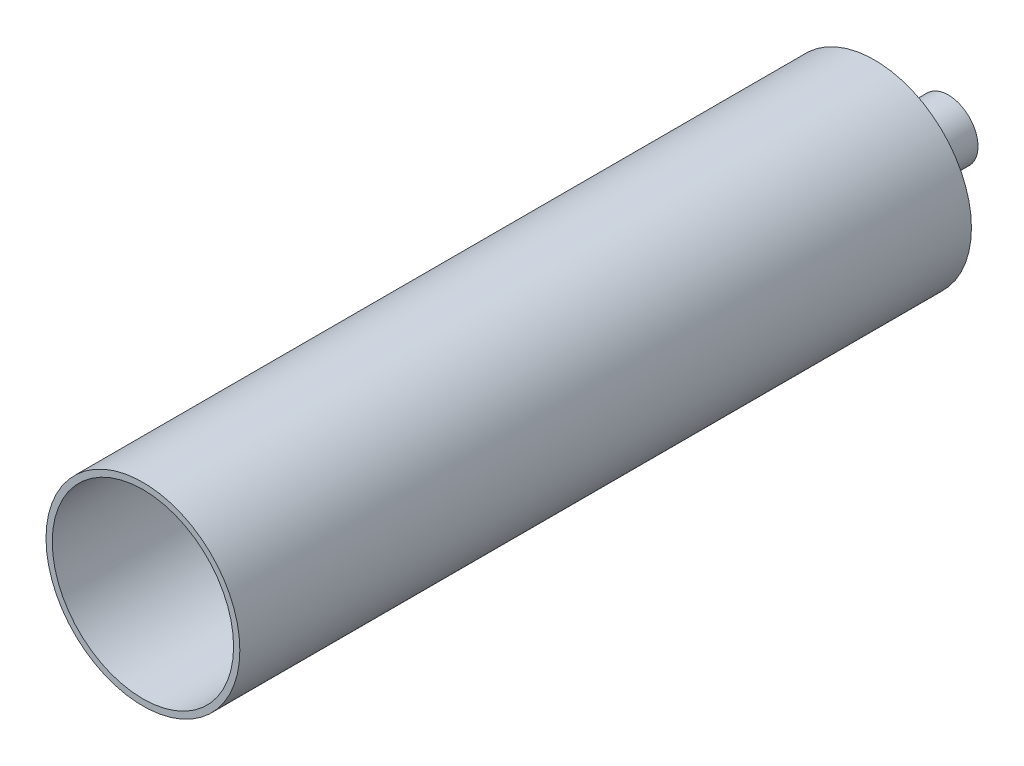
ISO-10303-21;
HEADER;
FILE_DESCRIPTION(('STEP AP214'),'2;1');
FILE_NAME('part.step','',(''),(''),'','','');
FILE_SCHEMA(('AUTOMOTIVE_DESIGN { 1 0 10303 214 1 1 1 1 }'));
ENDSEC;
DATA;
#1=APPLICATION_CONTEXT('core data for automotive mechanical design processes');
#2=APPLICATION_PROTOCOL_DEFINITION('international standard','automotive_design',2000,#1);
#3=PRODUCT_CONTEXT('',#1,'mechanical');
#4=PRODUCT('Part','Part','',(#3));
#5=PRODUCT_RELATED_PRODUCT_CATEGORY('part','',(#4));
#6=PRODUCT_DEFINITION_FORMATION('','',#4);
#7=PRODUCT_DEFINITION_CONTEXT('part definition',#1,'design');
#8=PRODUCT_DEFINITION('design','',#6,#7);
#9=PRODUCT_DEFINITION_SHAPE('','',#8);
#10=(LENGTH_UNIT() NAMED_UNIT(*) SI_UNIT(.MILLI.,.METRE.));
#11=(NAMED_UNIT(*) PLANE_ANGLE_UNIT() SI_UNIT($,.RADIAN.));
#12=(NAMED_UNIT(*) SI_UNIT($,.STERADIAN.) SOLID_ANGLE_UNIT());
#13=UNCERTAINTY_MEASURE_WITH_UNIT(LENGTH_MEASURE(1.E-05),#10,'distance_accuracy_value','');
#14=(GEOMETRIC_REPRESENTATION_CONTEXT(3) GLOBAL_UNCERTAINTY_ASSIGNED_CONTEXT((#13)) GLOBAL_UNIT_ASSIGNED_CONTEXT((#10,
#11,#12)) REPRESENTATION_CONTEXT('',''));
#15=CARTESIAN_POINT('',(0.,0.,0.));
#16=DIRECTION('',(0.,0.,1.));
#17=DIRECTION('',(1.,0.,0.));
#18=AXIS2_PLACEMENT_3D('',#15,#16,#17);
#19=CARTESIAN_POINT('',(0.,0.,117.));
#20=DIRECTION('',(0.,0.,1.));
#21=DIRECTION('',(1.,0.,0.));
#22=AXIS2_PLACEMENT_3D('',#19,#20,#21);
#23=PLANE('',#22);
#24=CARTESIAN_POINT('',(0.,0.,117.));
#25=DIRECTION('',(0.,0.,1.));
#26=DIRECTION('',(1.,0.,0.));
#27=AXIS2_PLACEMENT_3D('',#24,#25,#26);
#28=CIRCLE('',#27,15.5);
#29=CARTESIAN_POINT('',(15.5,0.,117.));
#30=VERTEX_POINT('',#29);
#31=EDGE_CURVE('E10',#30,#30,#28,.T.);
#32=ORIENTED_EDGE('',*,*,#31,.T.);
#33=EDGE_LOOP('',(#32));
#34=FACE_BOUND('',#33,.T.);
#35=CARTESIAN_POINT('',(0.,0.,117.));
#36=DIRECTION('',(0.,0.,1.));
#37=DIRECTION('',(1.,0.,0.));
#38=AXIS2_PLACEMENT_3D('',#35,#36,#37);
#39=CIRCLE('',#38,14.5);
#40=CARTESIAN_POINT('',(14.5,0.,117.));
#41=VERTEX_POINT('',#40);
#42=EDGE_CURVE('E45',#41,#41,#39,.T.);
#43=ORIENTED_EDGE('',*,*,#42,.F.);
#44=EDGE_LOOP('',(#43));
#45=FACE_BOUND('',#44,.T.);
#46=ADVANCED_FACE('F38',(#34,#45),#23,.T.);
#47=CARTESIAN_POINT('',(0.,0.,117.));
#48=DIRECTION('',(0.,0.,-1.));
#49=DIRECTION('',(-1.,0.,0.));
#50=AXIS2_PLACEMENT_3D('',#47,#48,#49);
#51=CYLINDRICAL_SURFACE('',#50,15.5);
#52=ORIENTED_EDGE('',*,*,#31,.F.);
#53=EDGE_LOOP('',(#52));
#54=FACE_BOUND('',#53,.T.);
#55=CARTESIAN_POINT('',(0.,0.,0.));
#56=DIRECTION('',(0.,0.,1.));
#57=DIRECTION('',(1.,0.,0.));
#58=AXIS2_PLACEMENT_3D('',#55,#56,#57);
#59=CIRCLE('',#58,15.5);
#60=CARTESIAN_POINT('',(15.5,0.,0.));
#61=VERTEX_POINT('',#60);
#62=EDGE_CURVE('E61',#61,#61,#59,.T.);
#63=ORIENTED_EDGE('',*,*,#62,.T.);
#64=EDGE_LOOP('',(#63));
#65=FACE_BOUND('',#64,.T.);
#66=ADVANCED_FACE('F40',(#54,#65),#51,.T.);
#67=CARTESIAN_POINT('',(0.,0.,117.));
#68=DIRECTION('',(0.,0.,-1.));
#69=DIRECTION('',(-1.,0.,0.));
#70=AXIS2_PLACEMENT_3D('',#67,#68,#69);
#71=CYLINDRICAL_SURFACE('',#70,14.5);
#72=ORIENTED_EDGE('',*,*,#42,.T.);
#73=EDGE_LOOP('',(#72));
#74=FACE_BOUND('',#73,.T.);
#75=CARTESIAN_POINT('',(0.,0.,0.));
#76=DIRECTION('',(0.,0.,1.));
#77=DIRECTION('',(1.,0.,0.));
#78=AXIS2_PLACEMENT_3D('',#75,#76,#77);
#79=CIRCLE('',#78,14.5);
#80=CARTESIAN_POINT('',(14.5,0.,0.));
#81=VERTEX_POINT('',#80);
#82=EDGE_CURVE('E49',#81,#81,#79,.T.);
#83=ORIENTED_EDGE('',*,*,#82,.F.);
#84=EDGE_LOOP('',(#83));
#85=FACE_BOUND('',#84,.T.);
#86=ADVANCED_FACE('F94',(#74,#85),#71,.F.);
#87=CARTESIAN_POINT('',(0.,0.,-3.3));
#88=DIRECTION('',(0.,0.,1.));
#89=DIRECTION('',(1.,0.,0.));
#90=AXIS2_PLACEMENT_3D('',#87,#88,#89);
#91=PLANE('',#90);
#92=CARTESIAN_POINT('',(0.,0.,-3.3));
#93=DIRECTION('',(0.,0.,1.));
#94=DIRECTION('',(1.,0.,0.));
#95=AXIS2_PLACEMENT_3D('',#92,#93,#94);
#96=CIRCLE('',#95,4.75);
#97=CARTESIAN_POINT('',(4.75,0.,-3.3));
#98=VERTEX_POINT('',#97);
#99=EDGE_CURVE('E54',#98,#98,#96,.T.);
#100=ORIENTED_EDGE('',*,*,#99,.T.);
#101=EDGE_LOOP('',(#100));
#102=FACE_BOUND('',#101,.T.);
#103=ADVANCED_FACE('F98',(#102),#91,.T.);
#104=CARTESIAN_POINT('',(0.,0.,-3.3));
#105=DIRECTION('',(0.,0.,1.));
#106=DIRECTION('',(1.,0.,0.));
#107=AXIS2_PLACEMENT_3D('',#104,#105,#106);
#108=CONICAL_SURFACE('',#107,4.75,1.19028994968253);
#109=CARTESIAN_POINT('',(0.,0.,0.));
#110=DIRECTION('',(0.,0.,1.));
#111=DIRECTION('',(1.,0.,0.));
#112=AXIS2_PLACEMENT_3D('',#109,#110,#111);
#113=CIRCLE('',#112,13.);
#114=CARTESIAN_POINT('',(13.,0.,0.));
#115=VERTEX_POINT('',#114);
#116=EDGE_CURVE('E58',#115,#115,#113,.T.);
#117=ORIENTED_EDGE('',*,*,#116,.T.);
#118=EDGE_LOOP('',(#117));
#119=FACE_BOUND('',#118,.T.);
#120=ORIENTED_EDGE('',*,*,#99,.F.);
#121=EDGE_LOOP('',(#120));
#122=FACE_BOUND('',#121,.T.);
#123=ADVANCED_FACE('F85',(#119,#122),#108,.F.);
#124=CARTESIAN_POINT('',(0.,0.,0.));
#125=DIRECTION('',(0.,0.,1.));
#126=DIRECTION('',(1.,0.,0.));
#127=AXIS2_PLACEMENT_3D('',#124,#125,#126);
#128=PLANE('',#127);
#129=ORIENTED_EDGE('',*,*,#116,.F.);
#130=EDGE_LOOP('',(#129));
#131=FACE_BOUND('',#130,.T.);
#132=ORIENTED_EDGE('',*,*,#82,.T.);
#133=EDGE_LOOP('',(#132));
#134=FACE_BOUND('',#133,.T.);
#135=ADVANCED_FACE('F77',(#131,#134),#128,.T.);
#136=CARTESIAN_POINT('',(0.,0.,-11.8));
#137=DIRECTION('',(0.,0.,-1.));
#138=DIRECTION('',(-1.,0.,0.));
#139=AXIS2_PLACEMENT_3D('',#136,#137,#138);
#140=PLANE('',#139);
#141=CARTESIAN_POINT('',(0.,0.,-11.8));
#142=DIRECTION('',(0.,0.,1.));
#143=DIRECTION('',(1.,0.,0.));
#144=AXIS2_PLACEMENT_3D('',#141,#142,#143);
#145=CIRCLE('',#144,4.75);
#146=CARTESIAN_POINT('',(4.75,0.,-11.8));
#147=VERTEX_POINT('',#146);
#148=EDGE_CURVE('E67',#147,#147,#145,.T.);
#149=ORIENTED_EDGE('',*,*,#148,.F.);
#150=EDGE_LOOP('',(#149));
#151=FACE_BOUND('',#150,.T.);
#152=ADVANCED_FACE('F74',(#151),#140,.T.);
#153=CARTESIAN_POINT('',(0.,0.,-4.3));
#154=DIRECTION('',(0.,0.,1.));
#155=DIRECTION('',(1.,0.,0.));
#156=AXIS2_PLACEMENT_3D('',#153,#154,#155);
#157=CONICAL_SURFACE('',#156,4.75,1.19028994968253);
#158=CARTESIAN_POINT('',(0.,0.,-4.3));
#159=DIRECTION('',(0.,0.,1.));
#160=DIRECTION('',(1.,0.,0.));
#161=AXIS2_PLACEMENT_3D('',#158,#159,#160);
#162=CIRCLE('',#161,4.75);
#163=CARTESIAN_POINT('',(4.75,0.,-4.3));
#164=VERTEX_POINT('',#163);
#165=EDGE_CURVE('E64',#164,#164,#162,.T.);
#166=CARTESIAN_POINT('',(15.5,0.,0.));
#167=CARTESIAN_POINT('',(15.3880208333333,0.,-0.0447916666666661));
#168=CARTESIAN_POINT('',(15.2760416666667,0.,-0.0895833333333329));
#169=CARTESIAN_POINT('',(15.0520833333333,0.,-0.179166666666667));
#170=CARTESIAN_POINT('',(14.9401041666667,0.,-0.223958333333333));
#171=CARTESIAN_POINT('',(14.7161458333333,0.,-0.313541666666667));
#172=CARTESIAN_POINT('',(14.6041666666667,0.,-0.358333333333333));
#173=CARTESIAN_POINT('',(14.3802083333333,0.,-0.447916666666666));
#174=CARTESIAN_POINT('',(14.2682291666667,0.,-0.492708333333333));
#175=CARTESIAN_POINT('',(14.0442708333333,0.,-0.582291666666666));
#176=CARTESIAN_POINT('',(13.9322916666667,0.,-0.627083333333333));
#177=CARTESIAN_POINT('',(13.7083333333333,0.,-0.716666666666667));
#178=CARTESIAN_POINT('',(13.5963541666667,0.,-0.761458333333333));
#179=CARTESIAN_POINT('',(13.3723958333333,0.,-0.851041666666666));
#180=CARTESIAN_POINT('',(13.2604166666667,0.,-0.895833333333333));
#181=CARTESIAN_POINT('',(13.0364583333333,0.,-0.985416666666666));
#182=CARTESIAN_POINT('',(12.9244791666667,0.,-1.03020833333333));
#183=CARTESIAN_POINT('',(12.7005208333333,0.,-1.11979166666667));
#184=CARTESIAN_POINT('',(12.5885416666667,0.,-1.16458333333333));
#185=CARTESIAN_POINT('',(12.3645833333333,0.,-1.25416666666667));
#186=CARTESIAN_POINT('',(12.2526041666667,0.,-1.29895833333333));
#187=CARTESIAN_POINT('',(12.0286458333333,0.,-1.38854166666667));
#188=CARTESIAN_POINT('',(11.9166666666667,0.,-1.43333333333333));
#189=CARTESIAN_POINT('',(11.6927083333333,0.,-1.52291666666667));
#190=CARTESIAN_POINT('',(11.5807291666667,0.,-1.56770833333333));
#191=CARTESIAN_POINT('',(11.3567708333333,0.,-1.65729166666667));
#192=CARTESIAN_POINT('',(11.2447916666667,0.,-1.70208333333333));
#193=CARTESIAN_POINT('',(11.0208333333333,0.,-1.79166666666667));
#194=CARTESIAN_POINT('',(10.9088541666667,0.,-1.83645833333333));
#195=CARTESIAN_POINT('',(10.6848958333333,0.,-1.92604166666667));
#196=CARTESIAN_POINT('',(10.5729166666667,0.,-1.97083333333333));
#197=CARTESIAN_POINT('',(10.3489583333333,0.,-2.06041666666667));
#198=CARTESIAN_POINT('',(10.2369791666667,0.,-2.10520833333333));
#199=CARTESIAN_POINT('',(10.0130208333333,0.,-2.19479166666667));
#200=CARTESIAN_POINT('',(9.90104166666667,0.,-2.23958333333333));
#201=CARTESIAN_POINT('',(9.67708333333333,0.,-2.32916666666667));
#202=CARTESIAN_POINT('',(9.56510416666667,0.,-2.37395833333333));
#203=CARTESIAN_POINT('',(9.34114583333333,0.,-2.46354166666667));
#204=CARTESIAN_POINT('',(9.22916666666666,0.,-2.50833333333333));
#205=CARTESIAN_POINT('',(9.00520833333333,0.,-2.59791666666667));
#206=CARTESIAN_POINT('',(8.89322916666667,0.,-2.64270833333333));
#207=CARTESIAN_POINT('',(8.66927083333333,0.,-2.73229166666667));
#208=CARTESIAN_POINT('',(8.55729166666667,0.,-2.77708333333333));
#209=CARTESIAN_POINT('',(8.33333333333333,0.,-2.86666666666667));
#210=CARTESIAN_POINT('',(8.22135416666667,0.,-2.91145833333333));
#211=CARTESIAN_POINT('',(7.99739583333333,0.,-3.00104166666667));
#212=CARTESIAN_POINT('',(7.88541666666667,0.,-3.04583333333333));
#213=CARTESIAN_POINT('',(7.66145833333333,0.,-3.13541666666667));
#214=CARTESIAN_POINT('',(7.54947916666667,0.,-3.18020833333333));
#215=CARTESIAN_POINT('',(7.32552083333333,0.,-3.26979166666667));
#216=CARTESIAN_POINT('',(7.21354166666667,0.,-3.31458333333333));
#217=CARTESIAN_POINT('',(6.98958333333333,0.,-3.40416666666667));
#218=CARTESIAN_POINT('',(6.87760416666667,0.,-3.44895833333333));
#219=CARTESIAN_POINT('',(6.65364583333333,0.,-3.53854166666666));
#220=CARTESIAN_POINT('',(6.54166666666667,0.,-3.58333333333333));
#221=CARTESIAN_POINT('',(6.31770833333333,0.,-3.67291666666666));
#222=CARTESIAN_POINT('',(6.20572916666667,0.,-3.71770833333333));
#223=CARTESIAN_POINT('',(5.98177083333333,0.,-3.80729166666667));
#224=CARTESIAN_POINT('',(5.86979166666667,0.,-3.85208333333333));
#225=CARTESIAN_POINT('',(5.64583333333333,0.,-3.94166666666667));
#226=CARTESIAN_POINT('',(5.53385416666667,0.,-3.98645833333333));
#227=CARTESIAN_POINT('',(5.30989583333333,0.,-4.07604166666667));
#228=CARTESIAN_POINT('',(5.19791666666667,0.,-4.12083333333333));
#229=CARTESIAN_POINT('',(4.97395833333333,0.,-4.21041666666667));
#230=CARTESIAN_POINT('',(4.86197916666667,0.,-4.25520833333333));
#231=CARTESIAN_POINT('',(4.75,0.,-4.3));
#232=B_SPLINE_CURVE_WITH_KNOTS('',3,(#166,#167,#168,#169,#170,#171,#172,#173,#174,#175,#176,
#177,#178,#179,#180,#181,#182,#183,#184,#185,#186,#187,#188,#189,#190,#191,#192,#193,#194,#195,
#196,#197,#198,#199,#200,#201,#202,#203,#204,#205,#206,#207,#208,#209,#210,#211,#212,#213,#214,
#215,#216,#217,#218,#219,#220,#221,#222,#223,#224,#225,#226,#227,#228,#229,#230,#231),
.UNSPECIFIED.,.F.,.F.,(4,2,2,2,2,2,2,2,2,2,2,2,2,2,2,2,2,2,2,2,2,2,2,2,2,2,2,2,2,2,2,2,4),(0.,
0.361815760479351,0.723631520958698,1.08544728143805,1.4472630419174,1.80907880239675,
2.1708945628761,2.53271032335545,2.89452608383479,3.25634184431415,3.6181576047935,
3.97997336527284,4.34178912575219,4.70360488623154,5.06542064671089,5.42723640719024,
5.78905216766959,6.15086792814894,6.51268368862829,6.87449944910764,7.23631520958699,
7.59813097006634,7.95994673054569,8.32176249102504,8.68357825150439,9.04539401198374,
9.40720977246309,9.76902553294244,10.1308412934218,10.4926570539011,10.8544728143805,
11.2162885748598,11.5781043353392),.UNSPECIFIED.);
#233=EDGE_CURVE('BSEAM76',#61,#164,#232,.T.);
#234=ORIENTED_EDGE('',*,*,#62,.F.);
#235=ORIENTED_EDGE('',*,*,#165,.T.);
#236=ORIENTED_EDGE('',*,*,#233,.T.);
#237=ORIENTED_EDGE('',*,*,#233,.F.);
#238=EDGE_LOOP('',(#234,#236,#235,#237));
#239=FACE_BOUND('',#238,.T.);
#240=ADVANCED_FACE('F76',(#239),#157,.T.);
#241=CARTESIAN_POINT('',(0.,0.,0.));
#242=DIRECTION('',(0.,0.,1.));
#243=DIRECTION('',(1.,0.,0.));
#244=AXIS2_PLACEMENT_3D('',#241,#242,#243);
#245=CYLINDRICAL_SURFACE('',#244,4.75);
#246=ORIENTED_EDGE('',*,*,#148,.T.);
#247=EDGE_LOOP('',(#246));
#248=FACE_BOUND('',#247,.T.);
#249=ORIENTED_EDGE('',*,*,#165,.F.);
#250=EDGE_LOOP('',(#249));
#251=FACE_BOUND('',#250,.T.);
#252=ADVANCED_FACE('F71',(#248,#251),#245,.T.);
#253=CLOSED_SHELL('',(#46,#66,#86,#103,#123,#135,#152,#240,#252));
#254=MANIFOLD_SOLID_BREP('B2',#253);
#255=ADVANCED_BREP_SHAPE_REPRESENTATION('',(#18,#254),#14);
#256=SHAPE_DEFINITION_REPRESENTATION(#9,#255);
ENDSEC;
END-ISO-10303-21;
